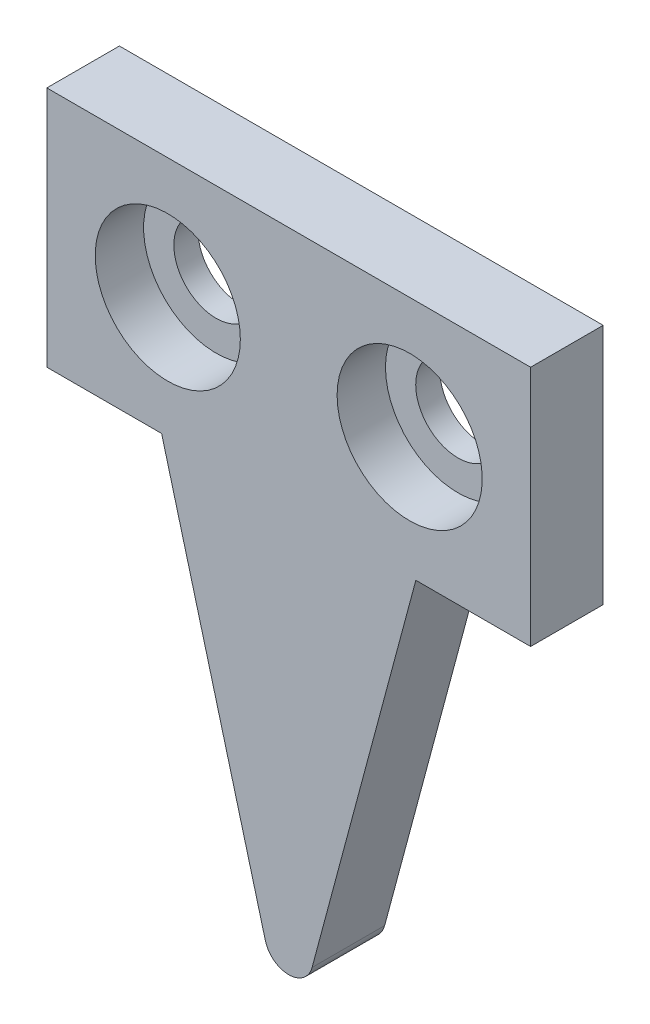
ISO-10303-21;
HEADER;
FILE_DESCRIPTION(('STEP AP214'),'2;1');
FILE_NAME('part.step','',(''),(''),'','','');
FILE_SCHEMA(('AUTOMOTIVE_DESIGN { 1 0 10303 214 1 1 1 1 }'));
ENDSEC;
DATA;
#1=APPLICATION_CONTEXT('core data for automotive mechanical design processes');
#2=APPLICATION_PROTOCOL_DEFINITION('international standard','automotive_design',2000,#1);
#3=PRODUCT_CONTEXT('',#1,'mechanical');
#4=PRODUCT('Part','Part','',(#3));
#5=PRODUCT_RELATED_PRODUCT_CATEGORY('part','',(#4));
#6=PRODUCT_DEFINITION_FORMATION('','',#4);
#7=PRODUCT_DEFINITION_CONTEXT('part definition',#1,'design');
#8=PRODUCT_DEFINITION('design','',#6,#7);
#9=PRODUCT_DEFINITION_SHAPE('','',#8);
#10=(LENGTH_UNIT() NAMED_UNIT(*) SI_UNIT(.MILLI.,.METRE.));
#11=(NAMED_UNIT(*) PLANE_ANGLE_UNIT() SI_UNIT($,.RADIAN.));
#12=(NAMED_UNIT(*) SI_UNIT($,.STERADIAN.) SOLID_ANGLE_UNIT());
#13=UNCERTAINTY_MEASURE_WITH_UNIT(LENGTH_MEASURE(1.E-05),#10,'distance_accuracy_value','');
#14=(GEOMETRIC_REPRESENTATION_CONTEXT(3) GLOBAL_UNCERTAINTY_ASSIGNED_CONTEXT((#13)) GLOBAL_UNIT_ASSIGNED_CONTEXT((#10,
#11,#12)) REPRESENTATION_CONTEXT('',''));
#15=CARTESIAN_POINT('',(0.,0.,0.));
#16=DIRECTION('',(0.,0.,1.));
#17=DIRECTION('',(1.,0.,0.));
#18=AXIS2_PLACEMENT_3D('',#15,#16,#17);
#19=CARTESIAN_POINT('',(-5.,20.75,-4.94974746830585));
#20=DIRECTION('',(0.,0.,1.));
#21=DIRECTION('',(1.,0.,0.));
#22=AXIS2_PLACEMENT_3D('',#19,#20,#21);
#23=CYLINDRICAL_SURFACE('',#22,1.75);
#24=CARTESIAN_POINT('',(-5.,20.75,0.));
#25=DIRECTION('',(0.,0.,1.));
#26=DIRECTION('',(1.,0.,0.));
#27=AXIS2_PLACEMENT_3D('',#24,#25,#26);
#28=CIRCLE('',#27,1.75);
#29=CARTESIAN_POINT('',(-3.25,20.75,0.));
#30=VERTEX_POINT('',#29);
#31=EDGE_CURVE('E145',#30,#30,#28,.F.);
#32=ORIENTED_EDGE('',*,*,#31,.T.);
#33=EDGE_LOOP('',(#32));
#34=FACE_BOUND('',#33,.T.);
#35=CARTESIAN_POINT('',(-5.,20.75,1.));
#36=DIRECTION('',(0.,0.,1.));
#37=DIRECTION('',(1.,0.,0.));
#38=AXIS2_PLACEMENT_3D('',#35,#36,#37);
#39=CIRCLE('',#38,1.75);
#40=CARTESIAN_POINT('',(-3.25,20.75,1.));
#41=VERTEX_POINT('',#40);
#42=EDGE_CURVE('E165',#41,#41,#39,.F.);
#43=ORIENTED_EDGE('',*,*,#42,.F.);
#44=EDGE_LOOP('',(#43));
#45=FACE_BOUND('',#44,.T.);
#46=ADVANCED_FACE('F39',(#34,#45),#23,.F.);
#47=CARTESIAN_POINT('',(10.,15.75,3.));
#48=DIRECTION('',(-1.,0.,0.));
#49=DIRECTION('',(0.,0.,1.));
#50=AXIS2_PLACEMENT_3D('',#47,#48,#49);
#51=PLANE('',#50);
#52=DIRECTION('',(0.,1.,0.));
#53=VECTOR('',#52,1.);
#54=CARTESIAN_POINT('',(10.,15.75,0.));
#55=LINE('',#54,#53);
#56=CARTESIAN_POINT('',(10.,15.75,0.));
#57=VERTEX_POINT('',#56);
#58=CARTESIAN_POINT('',(10.,25.75,0.));
#59=VERTEX_POINT('',#58);
#60=EDGE_CURVE('E140',#57,#59,#55,.T.);
#61=ORIENTED_EDGE('',*,*,#60,.T.);
#62=DIRECTION('',(0.,0.,-1.));
#63=VECTOR('',#62,1.);
#64=CARTESIAN_POINT('',(10.,25.75,3.));
#65=LINE('',#64,#63);
#66=CARTESIAN_POINT('',(10.,25.75,3.));
#67=VERTEX_POINT('',#66);
#68=EDGE_CURVE('E11',#67,#59,#65,.T.);
#69=ORIENTED_EDGE('',*,*,#68,.F.);
#70=DIRECTION('',(0.,1.,0.));
#71=VECTOR('',#70,1.);
#72=CARTESIAN_POINT('',(10.,15.75,3.));
#73=LINE('',#72,#71);
#74=CARTESIAN_POINT('',(10.,15.75,3.));
#75=VERTEX_POINT('',#74);
#76=EDGE_CURVE('E154',#75,#67,#73,.T.);
#77=ORIENTED_EDGE('',*,*,#76,.F.);
#78=DIRECTION('',(0.,0.,-1.));
#79=VECTOR('',#78,1.);
#80=CARTESIAN_POINT('',(10.,15.75,3.));
#81=LINE('',#80,#79);
#82=EDGE_CURVE('E131',#75,#57,#81,.T.);
#83=ORIENTED_EDGE('',*,*,#82,.T.);
#84=EDGE_LOOP('',(#61,#69,#77,#83));
#85=FACE_BOUND('',#84,.T.);
#86=ADVANCED_FACE('F41',(#85),#51,.F.);
#87=CARTESIAN_POINT('',(-10.,25.75,3.));
#88=DIRECTION('',(0.,-1.,0.));
#89=DIRECTION('',(0.,0.,-1.));
#90=AXIS2_PLACEMENT_3D('',#87,#88,#89);
#91=PLANE('',#90);
#92=DIRECTION('',(-1.,0.,0.));
#93=VECTOR('',#92,1.);
#94=CARTESIAN_POINT('',(-10.,25.75,0.));
#95=LINE('',#94,#93);
#96=CARTESIAN_POINT('',(-10.,25.75,0.));
#97=VERTEX_POINT('',#96);
#98=EDGE_CURVE('E142',#59,#97,#95,.T.);
#99=ORIENTED_EDGE('',*,*,#98,.T.);
#100=DIRECTION('',(0.,0.,-1.));
#101=VECTOR('',#100,1.);
#102=CARTESIAN_POINT('',(-10.,25.75,3.));
#103=LINE('',#102,#101);
#104=CARTESIAN_POINT('',(-10.,25.75,3.));
#105=VERTEX_POINT('',#104);
#106=EDGE_CURVE('E47',#105,#97,#103,.T.);
#107=ORIENTED_EDGE('',*,*,#106,.F.);
#108=DIRECTION('',(-1.,0.,0.));
#109=VECTOR('',#108,1.);
#110=CARTESIAN_POINT('',(-10.,25.75,3.));
#111=LINE('',#110,#109);
#112=EDGE_CURVE('E103',#67,#105,#111,.T.);
#113=ORIENTED_EDGE('',*,*,#112,.F.);
#114=ORIENTED_EDGE('',*,*,#68,.T.);
#115=EDGE_LOOP('',(#99,#107,#113,#114));
#116=FACE_BOUND('',#115,.T.);
#117=ADVANCED_FACE('F230',(#116),#91,.F.);
#118=CARTESIAN_POINT('',(-10.,15.75,3.));
#119=DIRECTION('',(1.,0.,0.));
#120=DIRECTION('',(0.,0.,-1.));
#121=AXIS2_PLACEMENT_3D('',#118,#119,#120);
#122=PLANE('',#121);
#123=DIRECTION('',(0.,-1.,0.));
#124=VECTOR('',#123,1.);
#125=CARTESIAN_POINT('',(-10.,15.75,0.));
#126=LINE('',#125,#124);
#127=CARTESIAN_POINT('',(-10.,15.75,0.));
#128=VERTEX_POINT('',#127);
#129=EDGE_CURVE('E144',#97,#128,#126,.T.);
#130=ORIENTED_EDGE('',*,*,#129,.T.);
#131=DIRECTION('',(0.,0.,-1.));
#132=VECTOR('',#131,1.);
#133=CARTESIAN_POINT('',(-10.,15.75,3.));
#134=LINE('',#133,#132);
#135=CARTESIAN_POINT('',(-10.,15.75,3.));
#136=VERTEX_POINT('',#135);
#137=EDGE_CURVE('E158',#136,#128,#134,.T.);
#138=ORIENTED_EDGE('',*,*,#137,.F.);
#139=DIRECTION('',(0.,-1.,0.));
#140=VECTOR('',#139,1.);
#141=CARTESIAN_POINT('',(-10.,15.75,3.));
#142=LINE('',#141,#140);
#143=EDGE_CURVE('E192',#105,#136,#142,.T.);
#144=ORIENTED_EDGE('',*,*,#143,.F.);
#145=ORIENTED_EDGE('',*,*,#106,.T.);
#146=EDGE_LOOP('',(#130,#138,#144,#145));
#147=FACE_BOUND('',#146,.T.);
#148=ADVANCED_FACE('F342',(#147),#122,.F.);
#149=CARTESIAN_POINT('',(-5.25547596120034,15.75,3.));
#150=DIRECTION('',(0.,1.,0.));
#151=DIRECTION('',(-1.,0.,0.));
#152=AXIS2_PLACEMENT_3D('',#149,#150,#151);
#153=PLANE('',#152);
#154=DIRECTION('',(1.,0.,0.));
#155=VECTOR('',#154,1.);
#156=CARTESIAN_POINT('',(-5.25547596120034,15.75,0.));
#157=LINE('',#156,#155);
#158=CARTESIAN_POINT('',(-5.25547596120034,15.75,0.));
#159=VERTEX_POINT('',#158);
#160=EDGE_CURVE('E147',#128,#159,#157,.T.);
#161=ORIENTED_EDGE('',*,*,#160,.T.);
#162=DIRECTION('',(0.,0.,-1.));
#163=VECTOR('',#162,1.);
#164=CARTESIAN_POINT('',(-5.25547596120034,15.75,3.));
#165=LINE('',#164,#163);
#166=CARTESIAN_POINT('',(-5.25547596120034,15.75,3.));
#167=VERTEX_POINT('',#166);
#168=EDGE_CURVE('E159',#167,#159,#165,.T.);
#169=ORIENTED_EDGE('',*,*,#168,.F.);
#170=DIRECTION('',(1.,0.,0.));
#171=VECTOR('',#170,1.);
#172=CARTESIAN_POINT('',(-5.25547596120034,15.75,3.));
#173=LINE('',#172,#171);
#174=EDGE_CURVE('E194',#136,#167,#173,.T.);
#175=ORIENTED_EDGE('',*,*,#174,.F.);
#176=ORIENTED_EDGE('',*,*,#137,.T.);
#177=EDGE_LOOP('',(#161,#169,#175,#176));
#178=FACE_BOUND('',#177,.T.);
#179=ADVANCED_FACE('F196',(#178),#153,.F.);
#180=CARTESIAN_POINT('',(-5.25547596120034,15.75,3.));
#181=DIRECTION('',(0.965925826289067,0.258819045102525,0.));
#182=DIRECTION('',(-0.258819045102525,0.965925826289067,0.));
#183=AXIS2_PLACEMENT_3D('',#180,#181,#182);
#184=PLANE('',#183);
#185=DIRECTION('',(0.258819045102525,-0.965925826289067,0.));
#186=VECTOR('',#185,1.);
#187=CARTESIAN_POINT('',(-5.25547596120034,15.75,0.));
#188=LINE('',#187,#186);
#189=CARTESIAN_POINT('',(-0.965925826289066,-0.258819045102525,0.));
#190=VERTEX_POINT('',#189);
#191=EDGE_CURVE('E149',#159,#190,#188,.T.);
#192=ORIENTED_EDGE('',*,*,#191,.T.);
#193=DIRECTION('',(0.,0.,-1.));
#194=VECTOR('',#193,1.);
#195=CARTESIAN_POINT('',(-0.965925826289066,-0.258819045102525,3.));
#196=LINE('',#195,#194);
#197=CARTESIAN_POINT('',(-0.965925826289066,-0.258819045102525,3.));
#198=VERTEX_POINT('',#197);
#199=EDGE_CURVE('E126',#198,#190,#196,.T.);
#200=ORIENTED_EDGE('',*,*,#199,.F.);
#201=DIRECTION('',(0.258819045102525,-0.965925826289067,0.));
#202=VECTOR('',#201,1.);
#203=CARTESIAN_POINT('',(-5.25547596120034,15.75,3.));
#204=LINE('',#203,#202);
#205=EDGE_CURVE('E119',#167,#198,#204,.T.);
#206=ORIENTED_EDGE('',*,*,#205,.F.);
#207=ORIENTED_EDGE('',*,*,#168,.T.);
#208=EDGE_LOOP('',(#192,#200,#206,#207));
#209=FACE_BOUND('',#208,.T.);
#210=ADVANCED_FACE('F205',(#209),#184,.F.);
#211=CARTESIAN_POINT('',(0.,0.,3.));
#212=DIRECTION('',(0.,0.,-1.));
#213=DIRECTION('',(-1.,0.,0.));
#214=AXIS2_PLACEMENT_3D('',#211,#212,#213);
#215=CYLINDRICAL_SURFACE('',#214,0.999999999999999);
#216=CARTESIAN_POINT('',(0.,0.,0.));
#217=DIRECTION('',(0.,0.,1.));
#218=DIRECTION('',(1.,0.,0.));
#219=AXIS2_PLACEMENT_3D('',#216,#217,#218);
#220=CIRCLE('',#219,0.999999999999999);
#221=CARTESIAN_POINT('',(0.965925826289066,-0.258819045102525,0.));
#222=VERTEX_POINT('',#221);
#223=EDGE_CURVE('E129',#190,#222,#220,.T.);
#224=ORIENTED_EDGE('',*,*,#223,.T.);
#225=DIRECTION('',(0.,0.,-1.));
#226=VECTOR('',#225,1.);
#227=CARTESIAN_POINT('',(0.965925826289066,-0.258819045102525,3.));
#228=LINE('',#227,#226);
#229=CARTESIAN_POINT('',(0.965925826289066,-0.258819045102525,3.));
#230=VERTEX_POINT('',#229);
#231=EDGE_CURVE('E123',#230,#222,#228,.T.);
#232=ORIENTED_EDGE('',*,*,#231,.F.);
#233=CARTESIAN_POINT('',(0.,0.,3.));
#234=DIRECTION('',(0.,0.,1.));
#235=DIRECTION('',(1.,0.,0.));
#236=AXIS2_PLACEMENT_3D('',#233,#234,#235);
#237=CIRCLE('',#236,0.999999999999999);
#238=EDGE_CURVE('E112',#198,#230,#237,.T.);
#239=ORIENTED_EDGE('',*,*,#238,.F.);
#240=ORIENTED_EDGE('',*,*,#199,.T.);
#241=EDGE_LOOP('',(#224,#232,#239,#240));
#242=FACE_BOUND('',#241,.T.);
#243=ADVANCED_FACE('F127',(#242),#215,.T.);
#244=CARTESIAN_POINT('',(5.25547596120034,15.75,3.));
#245=DIRECTION('',(-0.965925826289067,0.258819045102525,0.));
#246=DIRECTION('',(-0.258819045102525,-0.965925826289067,0.));
#247=AXIS2_PLACEMENT_3D('',#244,#245,#246);
#248=PLANE('',#247);
#249=DIRECTION('',(0.258819045102525,0.965925826289067,0.));
#250=VECTOR('',#249,1.);
#251=CARTESIAN_POINT('',(5.25547596120034,15.75,0.));
#252=LINE('',#251,#250);
#253=CARTESIAN_POINT('',(5.25547596120034,15.75,0.));
#254=VERTEX_POINT('',#253);
#255=EDGE_CURVE('E90',#222,#254,#252,.T.);
#256=ORIENTED_EDGE('',*,*,#255,.T.);
#257=DIRECTION('',(0.,0.,-1.));
#258=VECTOR('',#257,1.);
#259=CARTESIAN_POINT('',(5.25547596120034,15.75,3.));
#260=LINE('',#259,#258);
#261=CARTESIAN_POINT('',(5.25547596120034,15.75,3.));
#262=VERTEX_POINT('',#261);
#263=EDGE_CURVE('E128',#262,#254,#260,.T.);
#264=ORIENTED_EDGE('',*,*,#263,.F.);
#265=DIRECTION('',(0.258819045102525,0.965925826289067,0.));
#266=VECTOR('',#265,1.);
#267=CARTESIAN_POINT('',(5.25547596120034,15.75,3.));
#268=LINE('',#267,#266);
#269=EDGE_CURVE('E117',#230,#262,#268,.T.);
#270=ORIENTED_EDGE('',*,*,#269,.F.);
#271=ORIENTED_EDGE('',*,*,#231,.T.);
#272=EDGE_LOOP('',(#256,#264,#270,#271));
#273=FACE_BOUND('',#272,.T.);
#274=ADVANCED_FACE('F135',(#273),#248,.F.);
#275=CARTESIAN_POINT('',(5.25547596120034,15.75,3.));
#276=DIRECTION('',(0.,1.,0.));
#277=DIRECTION('',(-1.,0.,0.));
#278=AXIS2_PLACEMENT_3D('',#275,#276,#277);
#279=PLANE('',#278);
#280=DIRECTION('',(1.,0.,0.));
#281=VECTOR('',#280,1.);
#282=CARTESIAN_POINT('',(5.25547596120034,15.75,0.));
#283=LINE('',#282,#281);
#284=EDGE_CURVE('E95',#254,#57,#283,.T.);
#285=ORIENTED_EDGE('',*,*,#284,.T.);
#286=ORIENTED_EDGE('',*,*,#82,.F.);
#287=DIRECTION('',(1.,0.,0.));
#288=VECTOR('',#287,1.);
#289=CARTESIAN_POINT('',(5.25547596120034,15.75,3.));
#290=LINE('',#289,#288);
#291=EDGE_CURVE('E59',#262,#75,#290,.T.);
#292=ORIENTED_EDGE('',*,*,#291,.F.);
#293=ORIENTED_EDGE('',*,*,#263,.T.);
#294=EDGE_LOOP('',(#285,#286,#292,#293));
#295=FACE_BOUND('',#294,.T.);
#296=ADVANCED_FACE('F212',(#295),#279,.F.);
#297=CARTESIAN_POINT('',(0.,0.,3.));
#298=DIRECTION('',(0.,0.,1.));
#299=DIRECTION('',(1.,0.,0.));
#300=AXIS2_PLACEMENT_3D('',#297,#298,#299);
#301=PLANE('',#300);
#302=CARTESIAN_POINT('',(-5.,20.75,3.));
#303=DIRECTION('',(0.,0.,1.));
#304=DIRECTION('',(1.,0.,0.));
#305=AXIS2_PLACEMENT_3D('',#302,#303,#304);
#306=CIRCLE('',#305,3.);
#307=CARTESIAN_POINT('',(-2.,20.75,3.));
#308=VERTEX_POINT('',#307);
#309=EDGE_CURVE('E175',#308,#308,#306,.T.);
#310=ORIENTED_EDGE('',*,*,#309,.F.);
#311=EDGE_LOOP('',(#310));
#312=FACE_BOUND('',#311,.T.);
#313=CARTESIAN_POINT('',(5.,20.75,3.));
#314=DIRECTION('',(0.,0.,1.));
#315=DIRECTION('',(-1.,0.,0.));
#316=AXIS2_PLACEMENT_3D('',#313,#314,#315);
#317=CIRCLE('',#316,3.);
#318=CARTESIAN_POINT('',(2.,20.75,3.));
#319=VERTEX_POINT('',#318);
#320=EDGE_CURVE('E180',#319,#319,#317,.T.);
#321=ORIENTED_EDGE('',*,*,#320,.F.);
#322=EDGE_LOOP('',(#321));
#323=FACE_BOUND('',#322,.T.);
#324=ORIENTED_EDGE('',*,*,#76,.T.);
#325=ORIENTED_EDGE('',*,*,#112,.T.);
#326=ORIENTED_EDGE('',*,*,#143,.T.);
#327=ORIENTED_EDGE('',*,*,#174,.T.);
#328=ORIENTED_EDGE('',*,*,#205,.T.);
#329=ORIENTED_EDGE('',*,*,#238,.T.);
#330=ORIENTED_EDGE('',*,*,#269,.T.);
#331=ORIENTED_EDGE('',*,*,#291,.T.);
#332=EDGE_LOOP('',(#324,#325,#326,#327,#328,#329,#330,#331));
#333=FACE_BOUND('',#332,.T.);
#334=ADVANCED_FACE('F116',(#312,#323,#333),#301,.T.);
#335=CARTESIAN_POINT('',(0.,0.,0.));
#336=DIRECTION('',(0.,0.,1.));
#337=DIRECTION('',(1.,0.,0.));
#338=AXIS2_PLACEMENT_3D('',#335,#336,#337);
#339=PLANE('',#338);
#340=ORIENTED_EDGE('',*,*,#31,.F.);
#341=EDGE_LOOP('',(#340));
#342=FACE_BOUND('',#341,.T.);
#343=CARTESIAN_POINT('',(5.,20.75,0.));
#344=DIRECTION('',(0.,0.,1.));
#345=DIRECTION('',(1.,0.,0.));
#346=AXIS2_PLACEMENT_3D('',#343,#344,#345);
#347=CIRCLE('',#346,1.75);
#348=CARTESIAN_POINT('',(6.75000000000001,20.75,0.));
#349=VERTEX_POINT('',#348);
#350=EDGE_CURVE('E167',#349,#349,#347,.F.);
#351=ORIENTED_EDGE('',*,*,#350,.F.);
#352=EDGE_LOOP('',(#351));
#353=FACE_BOUND('',#352,.T.);
#354=ORIENTED_EDGE('',*,*,#60,.F.);
#355=ORIENTED_EDGE('',*,*,#284,.F.);
#356=ORIENTED_EDGE('',*,*,#255,.F.);
#357=ORIENTED_EDGE('',*,*,#223,.F.);
#358=ORIENTED_EDGE('',*,*,#191,.F.);
#359=ORIENTED_EDGE('',*,*,#160,.F.);
#360=ORIENTED_EDGE('',*,*,#129,.F.);
#361=ORIENTED_EDGE('',*,*,#98,.F.);
#362=EDGE_LOOP('',(#354,#355,#356,#357,#358,#359,#360,#361));
#363=FACE_BOUND('',#362,.T.);
#364=ADVANCED_FACE('F207',(#342,#353,#363),#339,.F.);
#365=CARTESIAN_POINT('',(5.,20.75,-4.94974746830585));
#366=DIRECTION('',(0.,0.,1.));
#367=DIRECTION('',(1.,0.,0.));
#368=AXIS2_PLACEMENT_3D('',#365,#366,#367);
#369=CYLINDRICAL_SURFACE('',#368,1.75);
#370=CARTESIAN_POINT('',(5.,20.75,1.));
#371=DIRECTION('',(0.,0.,-1.));
#372=DIRECTION('',(-1.,0.,0.));
#373=AXIS2_PLACEMENT_3D('',#370,#371,#372);
#374=CIRCLE('',#373,1.75);
#375=CARTESIAN_POINT('',(3.25,20.75,1.));
#376=VERTEX_POINT('',#375);
#377=EDGE_CURVE('E43',#376,#376,#374,.F.);
#378=ORIENTED_EDGE('',*,*,#377,.T.);
#379=EDGE_LOOP('',(#378));
#380=FACE_BOUND('',#379,.T.);
#381=ORIENTED_EDGE('',*,*,#350,.T.);
#382=EDGE_LOOP('',(#381));
#383=FACE_BOUND('',#382,.T.);
#384=ADVANCED_FACE('F232',(#380,#383),#369,.F.);
#385=CARTESIAN_POINT('',(-5.,20.75,1.));
#386=DIRECTION('',(0.,0.,1.));
#387=DIRECTION('',(1.,0.,0.));
#388=AXIS2_PLACEMENT_3D('',#385,#386,#387);
#389=PLANE('',#388);
#390=CARTESIAN_POINT('',(-5.,20.75,1.));
#391=DIRECTION('',(0.,0.,1.));
#392=DIRECTION('',(1.,0.,0.));
#393=AXIS2_PLACEMENT_3D('',#390,#391,#392);
#394=CIRCLE('',#393,3.);
#395=CARTESIAN_POINT('',(-2.,20.75,1.));
#396=VERTEX_POINT('',#395);
#397=EDGE_CURVE('E168',#396,#396,#394,.T.);
#398=ORIENTED_EDGE('',*,*,#397,.T.);
#399=EDGE_LOOP('',(#398));
#400=FACE_BOUND('',#399,.T.);
#401=ORIENTED_EDGE('',*,*,#42,.T.);
#402=EDGE_LOOP('',(#401));
#403=FACE_BOUND('',#402,.T.);
#404=ADVANCED_FACE('F240',(#400,#403),#389,.T.);
#405=CARTESIAN_POINT('',(-5.,20.75,1.));
#406=DIRECTION('',(0.,0.,1.));
#407=DIRECTION('',(1.,0.,0.));
#408=AXIS2_PLACEMENT_3D('',#405,#406,#407);
#409=CYLINDRICAL_SURFACE('',#408,3.);
#410=ORIENTED_EDGE('',*,*,#397,.F.);
#411=EDGE_LOOP('',(#410));
#412=FACE_BOUND('',#411,.T.);
#413=ORIENTED_EDGE('',*,*,#309,.T.);
#414=EDGE_LOOP('',(#413));
#415=FACE_BOUND('',#414,.T.);
#416=ADVANCED_FACE('F268',(#412,#415),#409,.F.);
#417=CARTESIAN_POINT('',(5.,20.75,1.));
#418=DIRECTION('',(0.,0.,-1.));
#419=DIRECTION('',(-1.,0.,0.));
#420=AXIS2_PLACEMENT_3D('',#417,#418,#419);
#421=PLANE('',#420);
#422=CARTESIAN_POINT('',(5.,20.75,1.));
#423=DIRECTION('',(0.,0.,1.));
#424=DIRECTION('',(-1.,0.,0.));
#425=AXIS2_PLACEMENT_3D('',#422,#423,#424);
#426=CIRCLE('',#425,3.);
#427=CARTESIAN_POINT('',(2.,20.75,1.));
#428=VERTEX_POINT('',#427);
#429=EDGE_CURVE('E185',#428,#428,#426,.T.);
#430=ORIENTED_EDGE('',*,*,#429,.T.);
#431=EDGE_LOOP('',(#430));
#432=FACE_BOUND('',#431,.T.);
#433=ORIENTED_EDGE('',*,*,#377,.F.);
#434=EDGE_LOOP('',(#433));
#435=FACE_BOUND('',#434,.T.);
#436=ADVANCED_FACE('F231',(#432,#435),#421,.F.);
#437=CARTESIAN_POINT('',(5.,20.75,1.));
#438=DIRECTION('',(0.,0.,1.));
#439=DIRECTION('',(1.,0.,0.));
#440=AXIS2_PLACEMENT_3D('',#437,#438,#439);
#441=CYLINDRICAL_SURFACE('',#440,3.);
#442=ORIENTED_EDGE('',*,*,#429,.F.);
#443=EDGE_LOOP('',(#442));
#444=FACE_BOUND('',#443,.T.);
#445=ORIENTED_EDGE('',*,*,#320,.T.);
#446=EDGE_LOOP('',(#445));
#447=FACE_BOUND('',#446,.T.);
#448=ADVANCED_FACE('F290',(#444,#447),#441,.F.);
#449=CLOSED_SHELL('',(#46,#86,#117,#148,#179,#210,#243,#274,#296,#334,#364,#384,#404,#416,#436,#448));
#450=MANIFOLD_SOLID_BREP('B2',#449);
#451=ADVANCED_BREP_SHAPE_REPRESENTATION('',(#18,#450),#14);
#452=SHAPE_DEFINITION_REPRESENTATION(#9,#451);
ENDSEC;
END-ISO-10303-21;
